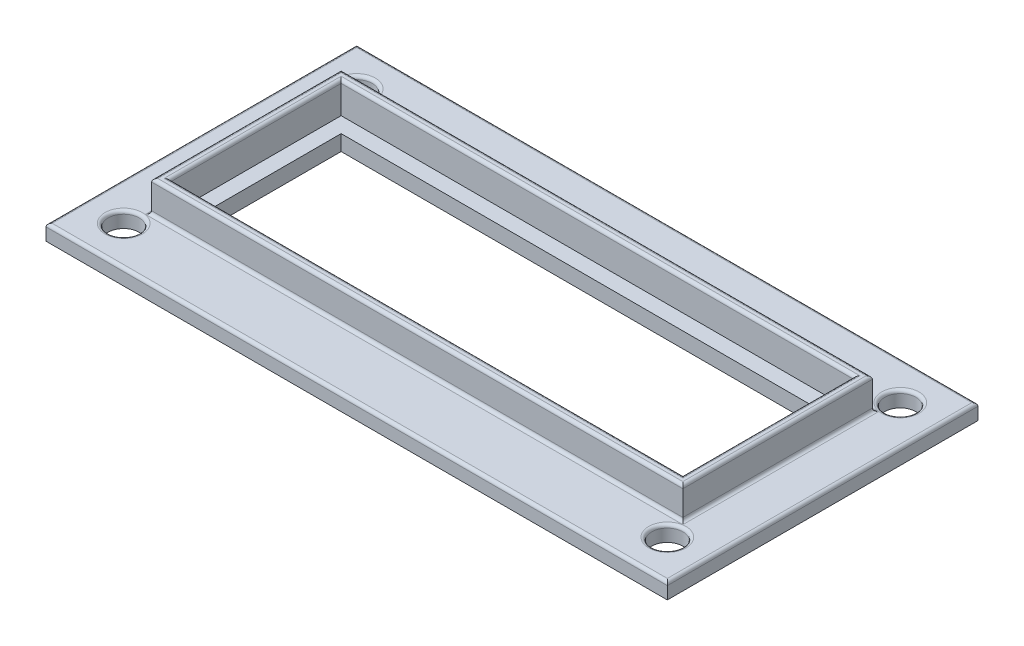
ISO-10303-21;
HEADER;
FILE_DESCRIPTION(('STEP AP214'),'2;1');
FILE_NAME('part.step','',(''),(''),'','','');
FILE_SCHEMA(('AUTOMOTIVE_DESIGN { 1 0 10303 214 1 1 1 1 }'));
ENDSEC;
DATA;
#1=APPLICATION_CONTEXT('core data for automotive mechanical design processes');
#2=APPLICATION_PROTOCOL_DEFINITION('international standard','automotive_design',2000,#1);
#3=PRODUCT_CONTEXT('',#1,'mechanical');
#4=PRODUCT('Part','Part','',(#3));
#5=PRODUCT_RELATED_PRODUCT_CATEGORY('part','',(#4));
#6=PRODUCT_DEFINITION_FORMATION('','',#4);
#7=PRODUCT_DEFINITION_CONTEXT('part definition',#1,'design');
#8=PRODUCT_DEFINITION('design','',#6,#7);
#9=PRODUCT_DEFINITION_SHAPE('','',#8);
#10=(LENGTH_UNIT() NAMED_UNIT(*) SI_UNIT(.MILLI.,.METRE.));
#11=(NAMED_UNIT(*) PLANE_ANGLE_UNIT() SI_UNIT($,.RADIAN.));
#12=(NAMED_UNIT(*) SI_UNIT($,.STERADIAN.) SOLID_ANGLE_UNIT());
#13=UNCERTAINTY_MEASURE_WITH_UNIT(LENGTH_MEASURE(1.E-05),#10,'distance_accuracy_value','');
#14=(GEOMETRIC_REPRESENTATION_CONTEXT(3) GLOBAL_UNCERTAINTY_ASSIGNED_CONTEXT((#13)) GLOBAL_UNIT_ASSIGNED_CONTEXT((#10,
#11,#12)) REPRESENTATION_CONTEXT('',''));
#15=CARTESIAN_POINT('',(0.,0.,0.));
#16=DIRECTION('',(0.,0.,1.));
#17=DIRECTION('',(1.,0.,0.));
#18=AXIS2_PLACEMENT_3D('',#15,#16,#17);
#19=CARTESIAN_POINT('',(0.,0.,0.));
#20=DIRECTION('',(0.,1.,0.));
#21=DIRECTION('',(0.,0.,1.));
#22=AXIS2_PLACEMENT_3D('',#19,#20,#21);
#23=PLANE('',#22);
#24=DIRECTION('',(0.,0.,1.));
#25=VECTOR('',#24,1.);
#26=CARTESIAN_POINT('',(-82.5,0.,-27.5));
#27=LINE('',#26,#25);
#28=CARTESIAN_POINT('',(-82.5,0.,-27.5));
#29=VERTEX_POINT('',#28);
#30=CARTESIAN_POINT('',(-82.5,0.,27.5));
#31=VERTEX_POINT('',#30);
#32=EDGE_CURVE('E283',#29,#31,#27,.T.);
#33=ORIENTED_EDGE('',*,*,#32,.T.);
#34=DIRECTION('',(1.,0.,0.));
#35=VECTOR('',#34,1.);
#36=CARTESIAN_POINT('',(-82.5,0.,27.5));
#37=LINE('',#36,#35);
#38=CARTESIAN_POINT('',(82.5,0.,27.5));
#39=VERTEX_POINT('',#38);
#40=EDGE_CURVE('E286',#31,#39,#37,.T.);
#41=ORIENTED_EDGE('',*,*,#40,.T.);
#42=DIRECTION('',(0.,0.,-1.));
#43=VECTOR('',#42,1.);
#44=CARTESIAN_POINT('',(82.5,0.,-27.5));
#45=LINE('',#44,#43);
#46=CARTESIAN_POINT('',(82.5,0.,-27.5));
#47=VERTEX_POINT('',#46);
#48=EDGE_CURVE('E269',#39,#47,#45,.T.);
#49=ORIENTED_EDGE('',*,*,#48,.T.);
#50=DIRECTION('',(-1.,0.,0.));
#51=VECTOR('',#50,1.);
#52=CARTESIAN_POINT('',(-82.5,0.,-27.5));
#53=LINE('',#52,#51);
#54=EDGE_CURVE('E280',#47,#29,#53,.T.);
#55=ORIENTED_EDGE('',*,*,#54,.T.);
#56=EDGE_LOOP('',(#33,#41,#49,#55));
#57=FACE_BOUND('',#56,.T.);
#58=DIRECTION('',(1.,0.,0.));
#59=VECTOR('',#58,1.);
#60=CARTESIAN_POINT('',(0.,0.,-22.5));
#61=LINE('',#60,#59);
#62=CARTESIAN_POINT('',(-77.5,0.,-22.5));
#63=VERTEX_POINT('',#62);
#64=CARTESIAN_POINT('',(77.5,0.,-22.5));
#65=VERTEX_POINT('',#64);
#66=EDGE_CURVE('E234',#63,#65,#61,.T.);
#67=ORIENTED_EDGE('',*,*,#66,.T.);
#68=DIRECTION('',(0.,0.,1.));
#69=VECTOR('',#68,1.);
#70=CARTESIAN_POINT('',(77.5,0.,0.));
#71=LINE('',#70,#69);
#72=CARTESIAN_POINT('',(77.5,0.,22.5));
#73=VERTEX_POINT('',#72);
#74=EDGE_CURVE('E203',#65,#73,#71,.T.);
#75=ORIENTED_EDGE('',*,*,#74,.T.);
#76=DIRECTION('',(-1.,0.,0.));
#77=VECTOR('',#76,1.);
#78=CARTESIAN_POINT('',(0.,0.,22.5));
#79=LINE('',#78,#77);
#80=CARTESIAN_POINT('',(-77.5,0.,22.5));
#81=VERTEX_POINT('',#80);
#82=EDGE_CURVE('E206',#73,#81,#79,.T.);
#83=ORIENTED_EDGE('',*,*,#82,.T.);
#84=DIRECTION('',(0.,0.,-1.));
#85=VECTOR('',#84,1.);
#86=CARTESIAN_POINT('',(-77.5,0.,0.));
#87=LINE('',#86,#85);
#88=EDGE_CURVE('E231',#81,#63,#87,.T.);
#89=ORIENTED_EDGE('',*,*,#88,.T.);
#90=EDGE_LOOP('',(#67,#75,#83,#89));
#91=FACE_BOUND('',#90,.T.);
#92=ADVANCED_FACE('F37',(#57,#91),#23,.T.);
#93=CARTESIAN_POINT('',(0.,-5.,0.));
#94=DIRECTION('',(0.,1.,0.));
#95=DIRECTION('',(0.,0.,1.));
#96=AXIS2_PLACEMENT_3D('',#93,#94,#95);
#97=PLANE('',#96);
#98=DIRECTION('',(0.,0.,-1.));
#99=VECTOR('',#98,1.);
#100=CARTESIAN_POINT('',(100.,-5.,-50.));
#101=LINE('',#100,#99);
#102=CARTESIAN_POINT('',(100.,-5.,50.));
#103=VERTEX_POINT('',#102);
#104=CARTESIAN_POINT('',(100.,-5.,-50.));
#105=VERTEX_POINT('',#104);
#106=EDGE_CURVE('E252',#103,#105,#101,.T.);
#107=ORIENTED_EDGE('',*,*,#106,.F.);
#108=DIRECTION('',(1.,0.,0.));
#109=VECTOR('',#108,1.);
#110=CARTESIAN_POINT('',(-100.,-5.,50.));
#111=LINE('',#110,#109);
#112=CARTESIAN_POINT('',(-100.,-5.,50.));
#113=VERTEX_POINT('',#112);
#114=EDGE_CURVE('E262',#113,#103,#111,.T.);
#115=ORIENTED_EDGE('',*,*,#114,.F.);
#116=DIRECTION('',(0.,0.,1.));
#117=VECTOR('',#116,1.);
#118=CARTESIAN_POINT('',(-100.,-5.,-50.));
#119=LINE('',#118,#117);
#120=CARTESIAN_POINT('',(-100.,-5.,-50.));
#121=VERTEX_POINT('',#120);
#122=EDGE_CURVE('E259',#121,#113,#119,.T.);
#123=ORIENTED_EDGE('',*,*,#122,.F.);
#124=DIRECTION('',(-1.,0.,0.));
#125=VECTOR('',#124,1.);
#126=CARTESIAN_POINT('',(-100.,-5.,-50.));
#127=LINE('',#126,#125);
#128=EDGE_CURVE('E255',#105,#121,#127,.T.);
#129=ORIENTED_EDGE('',*,*,#128,.F.);
#130=EDGE_LOOP('',(#107,#115,#123,#129));
#131=FACE_BOUND('',#130,.T.);
#132=CARTESIAN_POINT('',(-87.5,-5.,37.5));
#133=DIRECTION('',(0.,1.,0.));
#134=DIRECTION('',(0.,0.,1.));
#135=AXIS2_PLACEMENT_3D('',#132,#133,#134);
#136=CIRCLE('',#135,5.);
#137=CARTESIAN_POINT('',(-87.5,-5.,42.5));
#138=VERTEX_POINT('',#137);
#139=EDGE_CURVE('E248',#138,#138,#136,.T.);
#140=ORIENTED_EDGE('',*,*,#139,.T.);
#141=EDGE_LOOP('',(#140));
#142=FACE_BOUND('',#141,.T.);
#143=CARTESIAN_POINT('',(87.5,-5.,37.5));
#144=DIRECTION('',(0.,1.,0.));
#145=DIRECTION('',(0.,0.,1.));
#146=AXIS2_PLACEMENT_3D('',#143,#144,#145);
#147=CIRCLE('',#146,5.);
#148=CARTESIAN_POINT('',(87.5,-5.,42.5));
#149=VERTEX_POINT('',#148);
#150=EDGE_CURVE('E245',#149,#149,#147,.T.);
#151=ORIENTED_EDGE('',*,*,#150,.T.);
#152=EDGE_LOOP('',(#151));
#153=FACE_BOUND('',#152,.T.);
#154=CARTESIAN_POINT('',(87.5,-5.,-37.5));
#155=DIRECTION('',(0.,1.,0.));
#156=DIRECTION('',(0.,0.,1.));
#157=AXIS2_PLACEMENT_3D('',#154,#155,#156);
#158=CIRCLE('',#157,5.);
#159=CARTESIAN_POINT('',(87.5,-5.,-32.5));
#160=VERTEX_POINT('',#159);
#161=EDGE_CURVE('E241',#160,#160,#158,.T.);
#162=ORIENTED_EDGE('',*,*,#161,.T.);
#163=EDGE_LOOP('',(#162));
#164=FACE_BOUND('',#163,.T.);
#165=CARTESIAN_POINT('',(-87.5,-5.,-37.5));
#166=DIRECTION('',(0.,1.,0.));
#167=DIRECTION('',(0.,0.,1.));
#168=AXIS2_PLACEMENT_3D('',#165,#166,#167);
#169=CIRCLE('',#168,5.);
#170=CARTESIAN_POINT('',(-87.5,-5.,-32.5));
#171=VERTEX_POINT('',#170);
#172=EDGE_CURVE('E238',#171,#171,#169,.T.);
#173=ORIENTED_EDGE('',*,*,#172,.T.);
#174=EDGE_LOOP('',(#173));
#175=FACE_BOUND('',#174,.T.);
#176=DIRECTION('',(0.,0.,-1.));
#177=VECTOR('',#176,1.);
#178=CARTESIAN_POINT('',(77.5,-5.,22.5));
#179=LINE('',#178,#177);
#180=CARTESIAN_POINT('',(77.5,-5.,22.5));
#181=VERTEX_POINT('',#180);
#182=CARTESIAN_POINT('',(77.5,-5.,-22.5));
#183=VERTEX_POINT('',#182);
#184=EDGE_CURVE('E62',#181,#183,#179,.T.);
#185=ORIENTED_EDGE('',*,*,#184,.T.);
#186=DIRECTION('',(-1.,0.,0.));
#187=VECTOR('',#186,1.);
#188=CARTESIAN_POINT('',(-77.5,-5.,-22.5));
#189=LINE('',#188,#187);
#190=CARTESIAN_POINT('',(-77.5,-5.,-22.5));
#191=VERTEX_POINT('',#190);
#192=EDGE_CURVE('E210',#183,#191,#189,.T.);
#193=ORIENTED_EDGE('',*,*,#192,.T.);
#194=DIRECTION('',(0.,0.,1.));
#195=VECTOR('',#194,1.);
#196=CARTESIAN_POINT('',(-77.5,-5.,22.5));
#197=LINE('',#196,#195);
#198=CARTESIAN_POINT('',(-77.5,-5.,22.5));
#199=VERTEX_POINT('',#198);
#200=EDGE_CURVE('E216',#191,#199,#197,.T.);
#201=ORIENTED_EDGE('',*,*,#200,.T.);
#202=DIRECTION('',(1.,0.,0.));
#203=VECTOR('',#202,1.);
#204=CARTESIAN_POINT('',(-77.5,-5.,22.5));
#205=LINE('',#204,#203);
#206=EDGE_CURVE('E220',#199,#181,#205,.T.);
#207=ORIENTED_EDGE('',*,*,#206,.T.);
#208=EDGE_LOOP('',(#185,#193,#201,#207));
#209=FACE_BOUND('',#208,.T.);
#210=ADVANCED_FACE('F219',(#131,#142,#153,#164,#175,#209),#97,.F.);
#211=CARTESIAN_POINT('',(0.,10.,0.));
#212=DIRECTION('',(0.,-1.,0.));
#213=DIRECTION('',(0.,0.,-1.));
#214=AXIS2_PLACEMENT_3D('',#211,#212,#213);
#215=PLANE('',#214);
#216=DIRECTION('',(0.,0.,1.));
#217=VECTOR('',#216,1.);
#218=CARTESIAN_POINT('',(-83.5,10.,-27.5));
#219=LINE('',#218,#217);
#220=CARTESIAN_POINT('',(-83.5,10.,28.5));
#221=VERTEX_POINT('',#220);
#222=CARTESIAN_POINT('',(-83.5,10.,-28.5));
#223=VERTEX_POINT('',#222);
#224=EDGE_CURVE('E325',#221,#223,#219,.F.);
#225=ORIENTED_EDGE('',*,*,#224,.T.);
#226=DIRECTION('',(-1.,0.,0.));
#227=VECTOR('',#226,1.);
#228=CARTESIAN_POINT('',(82.5,10.,-28.5));
#229=LINE('',#228,#227);
#230=CARTESIAN_POINT('',(83.5,10.,-28.5));
#231=VERTEX_POINT('',#230);
#232=EDGE_CURVE('E327',#223,#231,#229,.F.);
#233=ORIENTED_EDGE('',*,*,#232,.T.);
#234=DIRECTION('',(0.,0.,-1.));
#235=VECTOR('',#234,1.);
#236=CARTESIAN_POINT('',(83.5,10.,27.5));
#237=LINE('',#236,#235);
#238=CARTESIAN_POINT('',(83.5,10.,28.5));
#239=VERTEX_POINT('',#238);
#240=EDGE_CURVE('E321',#231,#239,#237,.F.);
#241=ORIENTED_EDGE('',*,*,#240,.T.);
#242=DIRECTION('',(1.,0.,0.));
#243=VECTOR('',#242,1.);
#244=CARTESIAN_POINT('',(-82.5,10.,28.5));
#245=LINE('',#244,#243);
#246=EDGE_CURVE('E323',#239,#221,#245,.F.);
#247=ORIENTED_EDGE('',*,*,#246,.T.);
#248=EDGE_LOOP('',(#225,#233,#241,#247));
#249=FACE_BOUND('',#248,.T.);
#250=DIRECTION('',(1.,0.,0.));
#251=VECTOR('',#250,1.);
#252=CARTESIAN_POINT('',(0.,10.,29.5));
#253=LINE('',#252,#251);
#254=CARTESIAN_POINT('',(-84.5,10.,29.5));
#255=VERTEX_POINT('',#254);
#256=CARTESIAN_POINT('',(84.5,10.,29.5));
#257=VERTEX_POINT('',#256);
#258=EDGE_CURVE('E316',#255,#257,#253,.T.);
#259=ORIENTED_EDGE('',*,*,#258,.T.);
#260=DIRECTION('',(0.,0.,-1.));
#261=VECTOR('',#260,1.);
#262=CARTESIAN_POINT('',(84.5,10.,0.));
#263=LINE('',#262,#261);
#264=CARTESIAN_POINT('',(84.5,10.,-29.5));
#265=VERTEX_POINT('',#264);
#266=EDGE_CURVE('E318',#257,#265,#263,.T.);
#267=ORIENTED_EDGE('',*,*,#266,.T.);
#268=DIRECTION('',(-1.,0.,0.));
#269=VECTOR('',#268,1.);
#270=CARTESIAN_POINT('',(0.,10.,-29.5));
#271=LINE('',#270,#269);
#272=CARTESIAN_POINT('',(-84.5,10.,-29.5));
#273=VERTEX_POINT('',#272);
#274=EDGE_CURVE('E312',#265,#273,#271,.T.);
#275=ORIENTED_EDGE('',*,*,#274,.T.);
#276=DIRECTION('',(0.,0.,1.));
#277=VECTOR('',#276,1.);
#278=CARTESIAN_POINT('',(-84.5,10.,0.));
#279=LINE('',#278,#277);
#280=EDGE_CURVE('E314',#273,#255,#279,.T.);
#281=ORIENTED_EDGE('',*,*,#280,.T.);
#282=EDGE_LOOP('',(#259,#267,#275,#281));
#283=FACE_BOUND('',#282,.T.);
#284=ADVANCED_FACE('F478',(#249,#283),#215,.F.);
#285=CARTESIAN_POINT('',(-85.5,10.,-30.5));
#286=DIRECTION('',(0.,0.,1.));
#287=DIRECTION('',(1.,0.,0.));
#288=AXIS2_PLACEMENT_3D('',#285,#286,#287);
#289=PLANE('',#288);
#290=DIRECTION('',(0.,-1.,0.));
#291=VECTOR('',#290,1.);
#292=CARTESIAN_POINT('',(85.5,10.,-30.5));
#293=LINE('',#292,#291);
#294=CARTESIAN_POINT('',(85.5,9.,-30.5));
#295=VERTEX_POINT('',#294);
#296=CARTESIAN_POINT('',(85.5,0.999999999999999,-30.5));
#297=VERTEX_POINT('',#296);
#298=EDGE_CURVE('E297',#295,#297,#293,.T.);
#299=ORIENTED_EDGE('',*,*,#298,.T.);
#300=DIRECTION('',(-1.,0.,0.));
#301=VECTOR('',#300,1.);
#302=CARTESIAN_POINT('',(-85.5,0.999999999999999,-30.5));
#303=LINE('',#302,#301);
#304=CARTESIAN_POINT('',(-85.5,0.999999999999999,-30.5));
#305=VERTEX_POINT('',#304);
#306=EDGE_CURVE('E400',#297,#305,#303,.T.);
#307=ORIENTED_EDGE('',*,*,#306,.T.);
#308=DIRECTION('',(0.,-1.,0.));
#309=VECTOR('',#308,1.);
#310=CARTESIAN_POINT('',(-85.5,10.,-30.5));
#311=LINE('',#310,#309);
#312=CARTESIAN_POINT('',(-85.5,9.,-30.5));
#313=VERTEX_POINT('',#312);
#314=EDGE_CURVE('E306',#313,#305,#311,.T.);
#315=ORIENTED_EDGE('',*,*,#314,.F.);
#316=DIRECTION('',(-1.,0.,0.));
#317=VECTOR('',#316,1.);
#318=CARTESIAN_POINT('',(-85.5,9.,-30.5));
#319=LINE('',#318,#317);
#320=EDGE_CURVE('E343',#313,#295,#319,.F.);
#321=ORIENTED_EDGE('',*,*,#320,.T.);
#322=EDGE_LOOP('',(#299,#307,#315,#321));
#323=FACE_BOUND('',#322,.T.);
#324=ADVANCED_FACE('F937',(#323),#289,.F.);
#325=CARTESIAN_POINT('',(-85.5,10.,-30.5));
#326=DIRECTION('',(1.,0.,0.));
#327=DIRECTION('',(0.,0.,-1.));
#328=AXIS2_PLACEMENT_3D('',#325,#326,#327);
#329=PLANE('',#328);
#330=ORIENTED_EDGE('',*,*,#314,.T.);
#331=DIRECTION('',(0.,0.,1.));
#332=VECTOR('',#331,1.);
#333=CARTESIAN_POINT('',(-85.5,0.999999999999999,-30.5));
#334=LINE('',#333,#332);
#335=CARTESIAN_POINT('',(-85.5,0.999999999999999,30.5));
#336=VERTEX_POINT('',#335);
#337=EDGE_CURVE('E345',#305,#336,#334,.T.);
#338=ORIENTED_EDGE('',*,*,#337,.T.);
#339=DIRECTION('',(0.,-1.,0.));
#340=VECTOR('',#339,1.);
#341=CARTESIAN_POINT('',(-85.5,10.,30.5));
#342=LINE('',#341,#340);
#343=CARTESIAN_POINT('',(-85.5,9.,30.5));
#344=VERTEX_POINT('',#343);
#345=EDGE_CURVE('E303',#344,#336,#342,.T.);
#346=ORIENTED_EDGE('',*,*,#345,.F.);
#347=DIRECTION('',(0.,0.,1.));
#348=VECTOR('',#347,1.);
#349=CARTESIAN_POINT('',(-85.5,9.,-30.5));
#350=LINE('',#349,#348);
#351=EDGE_CURVE('E341',#344,#313,#350,.F.);
#352=ORIENTED_EDGE('',*,*,#351,.T.);
#353=EDGE_LOOP('',(#330,#338,#346,#352));
#354=FACE_BOUND('',#353,.T.);
#355=ADVANCED_FACE('F926',(#354),#329,.F.);
#356=CARTESIAN_POINT('',(-85.5,10.,30.5));
#357=DIRECTION('',(0.,0.,-1.));
#358=DIRECTION('',(-1.,0.,0.));
#359=AXIS2_PLACEMENT_3D('',#356,#357,#358);
#360=PLANE('',#359);
#361=ORIENTED_EDGE('',*,*,#345,.T.);
#362=DIRECTION('',(1.,0.,0.));
#363=VECTOR('',#362,1.);
#364=CARTESIAN_POINT('',(-85.5,0.999999999999999,30.5));
#365=LINE('',#364,#363);
#366=CARTESIAN_POINT('',(85.5,0.999999999999999,30.5));
#367=VERTEX_POINT('',#366);
#368=EDGE_CURVE('E396',#336,#367,#365,.T.);
#369=ORIENTED_EDGE('',*,*,#368,.T.);
#370=DIRECTION('',(0.,-1.,0.));
#371=VECTOR('',#370,1.);
#372=CARTESIAN_POINT('',(85.5,10.,30.5));
#373=LINE('',#372,#371);
#374=CARTESIAN_POINT('',(85.5,9.,30.5));
#375=VERTEX_POINT('',#374);
#376=EDGE_CURVE('E300',#375,#367,#373,.T.);
#377=ORIENTED_EDGE('',*,*,#376,.F.);
#378=DIRECTION('',(1.,0.,0.));
#379=VECTOR('',#378,1.);
#380=CARTESIAN_POINT('',(-85.5,9.,30.5));
#381=LINE('',#380,#379);
#382=EDGE_CURVE('E339',#375,#344,#381,.F.);
#383=ORIENTED_EDGE('',*,*,#382,.T.);
#384=EDGE_LOOP('',(#361,#369,#377,#383));
#385=FACE_BOUND('',#384,.T.);
#386=ADVANCED_FACE('F915',(#385),#360,.F.);
#387=CARTESIAN_POINT('',(85.5,10.,-30.5));
#388=DIRECTION('',(-1.,0.,0.));
#389=DIRECTION('',(0.,0.,1.));
#390=AXIS2_PLACEMENT_3D('',#387,#388,#389);
#391=PLANE('',#390);
#392=ORIENTED_EDGE('',*,*,#376,.T.);
#393=DIRECTION('',(0.,0.,-1.));
#394=VECTOR('',#393,1.);
#395=CARTESIAN_POINT('',(85.5,0.999999999999999,-30.5));
#396=LINE('',#395,#394);
#397=EDGE_CURVE('E398',#367,#297,#396,.T.);
#398=ORIENTED_EDGE('',*,*,#397,.T.);
#399=ORIENTED_EDGE('',*,*,#298,.F.);
#400=DIRECTION('',(0.,0.,-1.));
#401=VECTOR('',#400,1.);
#402=CARTESIAN_POINT('',(85.5,9.,-30.5));
#403=LINE('',#402,#401);
#404=EDGE_CURVE('E336',#295,#375,#403,.F.);
#405=ORIENTED_EDGE('',*,*,#404,.T.);
#406=EDGE_LOOP('',(#392,#398,#399,#405));
#407=FACE_BOUND('',#406,.T.);
#408=ADVANCED_FACE('F904',(#407),#391,.F.);
#409=CARTESIAN_POINT('',(82.5,10.,-27.5));
#410=DIRECTION('',(-1.,0.,0.));
#411=DIRECTION('',(0.,0.,1.));
#412=AXIS2_PLACEMENT_3D('',#409,#410,#411);
#413=PLANE('',#412);
#414=DIRECTION('',(0.,-1.,0.));
#415=VECTOR('',#414,1.);
#416=CARTESIAN_POINT('',(82.5,10.,27.5));
#417=LINE('',#416,#415);
#418=CARTESIAN_POINT('',(82.5,9.,27.5));
#419=VERTEX_POINT('',#418);
#420=EDGE_CURVE('E289',#419,#39,#417,.T.);
#421=ORIENTED_EDGE('',*,*,#420,.F.);
#422=DIRECTION('',(0.,0.,-1.));
#423=VECTOR('',#422,1.);
#424=CARTESIAN_POINT('',(82.5,9.,-27.5));
#425=LINE('',#424,#423);
#426=CARTESIAN_POINT('',(82.5,9.,-27.5));
#427=VERTEX_POINT('',#426);
#428=EDGE_CURVE('E334',#419,#427,#425,.T.);
#429=ORIENTED_EDGE('',*,*,#428,.T.);
#430=DIRECTION('',(0.,-1.,0.));
#431=VECTOR('',#430,1.);
#432=CARTESIAN_POINT('',(82.5,10.,-27.5));
#433=LINE('',#432,#431);
#434=EDGE_CURVE('E295',#427,#47,#433,.T.);
#435=ORIENTED_EDGE('',*,*,#434,.T.);
#436=ORIENTED_EDGE('',*,*,#48,.F.);
#437=EDGE_LOOP('',(#421,#429,#435,#436));
#438=FACE_BOUND('',#437,.T.);
#439=ADVANCED_FACE('F893',(#438),#413,.T.);
#440=CARTESIAN_POINT('',(-82.5,10.,-27.5));
#441=DIRECTION('',(0.,0.,1.));
#442=DIRECTION('',(1.,0.,0.));
#443=AXIS2_PLACEMENT_3D('',#440,#441,#442);
#444=PLANE('',#443);
#445=ORIENTED_EDGE('',*,*,#434,.F.);
#446=DIRECTION('',(-1.,0.,0.));
#447=VECTOR('',#446,1.);
#448=CARTESIAN_POINT('',(-82.5,9.,-27.5));
#449=LINE('',#448,#447);
#450=CARTESIAN_POINT('',(-82.5,9.,-27.5));
#451=VERTEX_POINT('',#450);
#452=EDGE_CURVE('E309',#427,#451,#449,.T.);
#453=ORIENTED_EDGE('',*,*,#452,.T.);
#454=DIRECTION('',(0.,-1.,0.));
#455=VECTOR('',#454,1.);
#456=CARTESIAN_POINT('',(-82.5,10.,-27.5));
#457=LINE('',#456,#455);
#458=EDGE_CURVE('E293',#451,#29,#457,.T.);
#459=ORIENTED_EDGE('',*,*,#458,.T.);
#460=ORIENTED_EDGE('',*,*,#54,.F.);
#461=EDGE_LOOP('',(#445,#453,#459,#460));
#462=FACE_BOUND('',#461,.T.);
#463=ADVANCED_FACE('F882',(#462),#444,.T.);
#464=CARTESIAN_POINT('',(-82.5,10.,-27.5));
#465=DIRECTION('',(1.,0.,0.));
#466=DIRECTION('',(0.,0.,-1.));
#467=AXIS2_PLACEMENT_3D('',#464,#465,#466);
#468=PLANE('',#467);
#469=ORIENTED_EDGE('',*,*,#458,.F.);
#470=DIRECTION('',(0.,0.,1.));
#471=VECTOR('',#470,1.);
#472=CARTESIAN_POINT('',(-82.5,9.,27.5));
#473=LINE('',#472,#471);
#474=CARTESIAN_POINT('',(-82.5,9.,27.5));
#475=VERTEX_POINT('',#474);
#476=EDGE_CURVE('E330',#451,#475,#473,.T.);
#477=ORIENTED_EDGE('',*,*,#476,.T.);
#478=DIRECTION('',(0.,-1.,0.));
#479=VECTOR('',#478,1.);
#480=CARTESIAN_POINT('',(-82.5,10.,27.5));
#481=LINE('',#480,#479);
#482=EDGE_CURVE('E291',#475,#31,#481,.T.);
#483=ORIENTED_EDGE('',*,*,#482,.T.);
#484=ORIENTED_EDGE('',*,*,#32,.F.);
#485=EDGE_LOOP('',(#469,#477,#483,#484));
#486=FACE_BOUND('',#485,.T.);
#487=ADVANCED_FACE('F489',(#486),#468,.T.);
#488=CARTESIAN_POINT('',(-82.5,10.,27.5));
#489=DIRECTION('',(0.,0.,-1.));
#490=DIRECTION('',(-1.,0.,0.));
#491=AXIS2_PLACEMENT_3D('',#488,#489,#490);
#492=PLANE('',#491);
#493=ORIENTED_EDGE('',*,*,#482,.F.);
#494=DIRECTION('',(1.,0.,0.));
#495=VECTOR('',#494,1.);
#496=CARTESIAN_POINT('',(82.5,9.,27.5));
#497=LINE('',#496,#495);
#498=EDGE_CURVE('E332',#475,#419,#497,.T.);
#499=ORIENTED_EDGE('',*,*,#498,.T.);
#500=ORIENTED_EDGE('',*,*,#420,.T.);
#501=ORIENTED_EDGE('',*,*,#40,.F.);
#502=EDGE_LOOP('',(#493,#499,#500,#501));
#503=FACE_BOUND('',#502,.T.);
#504=ADVANCED_FACE('F482',(#503),#492,.T.);
#505=DIRECTION('',(1.,0.,0.));
#506=VECTOR('',#505,1.);
#507=CARTESIAN_POINT('',(0.,0.,31.5));
#508=LINE('',#507,#506);
#509=CARTESIAN_POINT('',(86.5,0.,31.5));
#510=VERTEX_POINT('',#509);
#511=CARTESIAN_POINT('',(-86.5,0.,31.5));
#512=VERTEX_POINT('',#511);
#513=EDGE_CURVE('E391',#510,#512,#508,.F.);
#514=ORIENTED_EDGE('',*,*,#513,.T.);
#515=DIRECTION('',(0.,0.,1.));
#516=VECTOR('',#515,1.);
#517=CARTESIAN_POINT('',(-86.5,0.,0.));
#518=LINE('',#517,#516);
#519=CARTESIAN_POINT('',(-86.5,0.,-31.5));
#520=VERTEX_POINT('',#519);
#521=EDGE_CURVE('E393',#512,#520,#518,.F.);
#522=ORIENTED_EDGE('',*,*,#521,.T.);
#523=DIRECTION('',(-1.,0.,0.));
#524=VECTOR('',#523,1.);
#525=CARTESIAN_POINT('',(0.,0.,-31.5));
#526=LINE('',#525,#524);
#527=CARTESIAN_POINT('',(86.5,0.,-31.5));
#528=VERTEX_POINT('',#527);
#529=EDGE_CURVE('E387',#520,#528,#526,.F.);
#530=ORIENTED_EDGE('',*,*,#529,.T.);
#531=DIRECTION('',(0.,0.,-1.));
#532=VECTOR('',#531,1.);
#533=CARTESIAN_POINT('',(86.5,0.,0.));
#534=LINE('',#533,#532);
#535=EDGE_CURVE('E389',#528,#510,#534,.F.);
#536=ORIENTED_EDGE('',*,*,#535,.T.);
#537=EDGE_LOOP('',(#514,#522,#530,#536));
#538=FACE_BOUND('',#537,.T.);
#539=DIRECTION('',(0.,0.,1.));
#540=VECTOR('',#539,1.);
#541=CARTESIAN_POINT('',(-99.,0.,0.));
#542=LINE('',#541,#540);
#543=CARTESIAN_POINT('',(-99.,0.,-49.));
#544=VERTEX_POINT('',#543);
#545=CARTESIAN_POINT('',(-99.,0.,49.));
#546=VERTEX_POINT('',#545);
#547=EDGE_CURVE('E382',#544,#546,#542,.T.);
#548=ORIENTED_EDGE('',*,*,#547,.T.);
#549=DIRECTION('',(1.,0.,0.));
#550=VECTOR('',#549,1.);
#551=CARTESIAN_POINT('',(0.,0.,49.));
#552=LINE('',#551,#550);
#553=CARTESIAN_POINT('',(99.,0.,49.));
#554=VERTEX_POINT('',#553);
#555=EDGE_CURVE('E384',#546,#554,#552,.T.);
#556=ORIENTED_EDGE('',*,*,#555,.T.);
#557=DIRECTION('',(0.,0.,-1.));
#558=VECTOR('',#557,1.);
#559=CARTESIAN_POINT('',(99.,0.,0.));
#560=LINE('',#559,#558);
#561=CARTESIAN_POINT('',(99.,0.,-49.));
#562=VERTEX_POINT('',#561);
#563=EDGE_CURVE('E378',#554,#562,#560,.T.);
#564=ORIENTED_EDGE('',*,*,#563,.T.);
#565=DIRECTION('',(-1.,0.,0.));
#566=VECTOR('',#565,1.);
#567=CARTESIAN_POINT('',(0.,0.,-49.));
#568=LINE('',#567,#566);
#569=EDGE_CURVE('E380',#562,#544,#568,.T.);
#570=ORIENTED_EDGE('',*,*,#569,.T.);
#571=EDGE_LOOP('',(#548,#556,#564,#570));
#572=FACE_BOUND('',#571,.T.);
#573=CARTESIAN_POINT('',(-87.5,0.,37.5));
#574=DIRECTION('',(0.,1.,0.));
#575=DIRECTION('',(0.,0.,1.));
#576=AXIS2_PLACEMENT_3D('',#573,#574,#575);
#577=CIRCLE('',#576,6.);
#578=CARTESIAN_POINT('',(-87.5,0.,43.5));
#579=VERTEX_POINT('',#578);
#580=EDGE_CURVE('E375',#579,#579,#577,.F.);
#581=ORIENTED_EDGE('',*,*,#580,.T.);
#582=EDGE_LOOP('',(#581));
#583=FACE_BOUND('',#582,.T.);
#584=CARTESIAN_POINT('',(87.5,0.,37.5));
#585=DIRECTION('',(0.,1.,0.));
#586=DIRECTION('',(0.,0.,1.));
#587=AXIS2_PLACEMENT_3D('',#584,#585,#586);
#588=CIRCLE('',#587,6.);
#589=CARTESIAN_POINT('',(87.5,0.,43.5));
#590=VERTEX_POINT('',#589);
#591=EDGE_CURVE('E372',#590,#590,#588,.F.);
#592=ORIENTED_EDGE('',*,*,#591,.T.);
#593=EDGE_LOOP('',(#592));
#594=FACE_BOUND('',#593,.T.);
#595=CARTESIAN_POINT('',(87.5,0.,-37.5));
#596=DIRECTION('',(0.,1.,0.));
#597=DIRECTION('',(0.,0.,1.));
#598=AXIS2_PLACEMENT_3D('',#595,#596,#597);
#599=CIRCLE('',#598,6.);
#600=CARTESIAN_POINT('',(87.5,0.,-31.5));
#601=VERTEX_POINT('',#600);
#602=EDGE_CURVE('E369',#601,#601,#599,.F.);
#603=ORIENTED_EDGE('',*,*,#602,.T.);
#604=EDGE_LOOP('',(#603));
#605=FACE_BOUND('',#604,.T.);
#606=CARTESIAN_POINT('',(-87.5,0.,-37.5));
#607=DIRECTION('',(0.,1.,0.));
#608=DIRECTION('',(0.,0.,1.));
#609=AXIS2_PLACEMENT_3D('',#606,#607,#608);
#610=CIRCLE('',#609,6.);
#611=CARTESIAN_POINT('',(-87.5,0.,-31.5));
#612=VERTEX_POINT('',#611);
#613=EDGE_CURVE('E366',#612,#612,#610,.F.);
#614=ORIENTED_EDGE('',*,*,#613,.T.);
#615=EDGE_LOOP('',(#614));
#616=FACE_BOUND('',#615,.T.);
#617=ADVANCED_FACE('F474',(#538,#572,#583,#594,#605,#616),#23,.T.);
#618=CARTESIAN_POINT('',(100.,-5.,-50.));
#619=DIRECTION('',(1.,0.,0.));
#620=DIRECTION('',(0.,0.,-1.));
#621=AXIS2_PLACEMENT_3D('',#618,#619,#620);
#622=PLANE('',#621);
#623=DIRECTION('',(0.,1.,0.));
#624=VECTOR('',#623,1.);
#625=CARTESIAN_POINT('',(100.,-5.,-50.));
#626=LINE('',#625,#624);
#627=CARTESIAN_POINT('',(100.,-1.,-50.));
#628=VERTEX_POINT('',#627);
#629=EDGE_CURVE('E265',#105,#628,#626,.T.);
#630=ORIENTED_EDGE('',*,*,#629,.T.);
#631=DIRECTION('',(0.,0.,-1.));
#632=VECTOR('',#631,1.);
#633=CARTESIAN_POINT('',(100.,-1.,-50.));
#634=LINE('',#633,#632);
#635=CARTESIAN_POINT('',(100.,-1.,50.));
#636=VERTEX_POINT('',#635);
#637=EDGE_CURVE('E409',#628,#636,#634,.F.);
#638=ORIENTED_EDGE('',*,*,#637,.T.);
#639=DIRECTION('',(0.,1.,0.));
#640=VECTOR('',#639,1.);
#641=CARTESIAN_POINT('',(100.,-5.,50.));
#642=LINE('',#641,#640);
#643=EDGE_CURVE('E266',#103,#636,#642,.T.);
#644=ORIENTED_EDGE('',*,*,#643,.F.);
#645=ORIENTED_EDGE('',*,*,#106,.T.);
#646=EDGE_LOOP('',(#630,#638,#644,#645));
#647=FACE_BOUND('',#646,.T.);
#648=ADVANCED_FACE('F451',(#647),#622,.T.);
#649=CARTESIAN_POINT('',(-100.,-5.,50.));
#650=DIRECTION('',(0.,0.,1.));
#651=DIRECTION('',(1.,0.,0.));
#652=AXIS2_PLACEMENT_3D('',#649,#650,#651);
#653=PLANE('',#652);
#654=ORIENTED_EDGE('',*,*,#643,.T.);
#655=DIRECTION('',(1.,0.,0.));
#656=VECTOR('',#655,1.);
#657=CARTESIAN_POINT('',(-100.,-1.,50.));
#658=LINE('',#657,#656);
#659=CARTESIAN_POINT('',(-100.,-1.,50.));
#660=VERTEX_POINT('',#659);
#661=EDGE_CURVE('E402',#636,#660,#658,.F.);
#662=ORIENTED_EDGE('',*,*,#661,.T.);
#663=DIRECTION('',(0.,1.,0.));
#664=VECTOR('',#663,1.);
#665=CARTESIAN_POINT('',(-100.,-5.,50.));
#666=LINE('',#665,#664);
#667=EDGE_CURVE('E270',#113,#660,#666,.T.);
#668=ORIENTED_EDGE('',*,*,#667,.F.);
#669=ORIENTED_EDGE('',*,*,#114,.T.);
#670=EDGE_LOOP('',(#654,#662,#668,#669));
#671=FACE_BOUND('',#670,.T.);
#672=ADVANCED_FACE('F458',(#671),#653,.T.);
#673=CARTESIAN_POINT('',(-100.,-5.,-50.));
#674=DIRECTION('',(-1.,0.,0.));
#675=DIRECTION('',(0.,0.,1.));
#676=AXIS2_PLACEMENT_3D('',#673,#674,#675);
#677=PLANE('',#676);
#678=ORIENTED_EDGE('',*,*,#667,.T.);
#679=DIRECTION('',(0.,0.,1.));
#680=VECTOR('',#679,1.);
#681=CARTESIAN_POINT('',(-100.,-1.,-50.));
#682=LINE('',#681,#680);
#683=CARTESIAN_POINT('',(-100.,-1.,-50.));
#684=VERTEX_POINT('',#683);
#685=EDGE_CURVE('E405',#660,#684,#682,.F.);
#686=ORIENTED_EDGE('',*,*,#685,.T.);
#687=DIRECTION('',(0.,1.,0.));
#688=VECTOR('',#687,1.);
#689=CARTESIAN_POINT('',(-100.,-5.,-50.));
#690=LINE('',#689,#688);
#691=EDGE_CURVE('E273',#121,#684,#690,.T.);
#692=ORIENTED_EDGE('',*,*,#691,.F.);
#693=ORIENTED_EDGE('',*,*,#122,.T.);
#694=EDGE_LOOP('',(#678,#686,#692,#693));
#695=FACE_BOUND('',#694,.T.);
#696=ADVANCED_FACE('F461',(#695),#677,.T.);
#697=CARTESIAN_POINT('',(-100.,-5.,-50.));
#698=DIRECTION('',(0.,0.,-1.));
#699=DIRECTION('',(-1.,0.,0.));
#700=AXIS2_PLACEMENT_3D('',#697,#698,#699);
#701=PLANE('',#700);
#702=ORIENTED_EDGE('',*,*,#691,.T.);
#703=DIRECTION('',(-1.,0.,0.));
#704=VECTOR('',#703,1.);
#705=CARTESIAN_POINT('',(-100.,-1.,-50.));
#706=LINE('',#705,#704);
#707=EDGE_CURVE('E407',#684,#628,#706,.F.);
#708=ORIENTED_EDGE('',*,*,#707,.T.);
#709=ORIENTED_EDGE('',*,*,#629,.F.);
#710=ORIENTED_EDGE('',*,*,#128,.T.);
#711=EDGE_LOOP('',(#702,#708,#709,#710));
#712=FACE_BOUND('',#711,.T.);
#713=ADVANCED_FACE('F448',(#712),#701,.T.);
#714=CARTESIAN_POINT('',(-82.5,9.,28.5));
#715=DIRECTION('',(-1.,0.,0.));
#716=DIRECTION('',(0.,0.,1.));
#717=AXIS2_PLACEMENT_3D('',#714,#715,#716);
#718=CYLINDRICAL_SURFACE('',#717,1.);
#719=CARTESIAN_POINT('',(-83.5,9.,28.5));
#720=DIRECTION('',(-0.707106781186547,0.,-0.707106781186547));
#721=DIRECTION('',(0.707106781186547,0.,-0.707106781186547));
#722=AXIS2_PLACEMENT_3D('',#719,#720,#721);
#723=ELLIPSE('',#722,1.41421356237309,1.);
#724=EDGE_CURVE('E351',#221,#475,#723,.T.);
#725=ORIENTED_EDGE('',*,*,#724,.F.);
#726=ORIENTED_EDGE('',*,*,#246,.F.);
#727=CARTESIAN_POINT('',(83.5,9.,28.5));
#728=DIRECTION('',(-0.707106781186547,0.,0.707106781186547));
#729=DIRECTION('',(-0.707106781186547,0.,-0.707106781186547));
#730=AXIS2_PLACEMENT_3D('',#727,#728,#729);
#731=ELLIPSE('',#730,1.41421356237309,1.);
#732=EDGE_CURVE('E256',#419,#239,#731,.F.);
#733=ORIENTED_EDGE('',*,*,#732,.F.);
#734=ORIENTED_EDGE('',*,*,#498,.F.);
#735=EDGE_LOOP('',(#725,#726,#733,#734));
#736=FACE_BOUND('',#735,.T.);
#737=ADVANCED_FACE('F468',(#736),#718,.T.);
#738=CARTESIAN_POINT('',(83.5,9.,-27.5));
#739=DIRECTION('',(0.,0.,1.));
#740=DIRECTION('',(1.,0.,0.));
#741=AXIS2_PLACEMENT_3D('',#738,#739,#740);
#742=CYLINDRICAL_SURFACE('',#741,1.);
#743=ORIENTED_EDGE('',*,*,#732,.T.);
#744=ORIENTED_EDGE('',*,*,#240,.F.);
#745=CARTESIAN_POINT('',(83.5,9.,-28.5));
#746=DIRECTION('',(0.707106781186547,0.,0.707106781186547));
#747=DIRECTION('',(0.707106781186547,0.,-0.707106781186547));
#748=AXIS2_PLACEMENT_3D('',#745,#746,#747);
#749=ELLIPSE('',#748,1.41421356237309,1.);
#750=EDGE_CURVE('E348',#427,#231,#749,.F.);
#751=ORIENTED_EDGE('',*,*,#750,.F.);
#752=ORIENTED_EDGE('',*,*,#428,.F.);
#753=EDGE_LOOP('',(#743,#744,#751,#752));
#754=FACE_BOUND('',#753,.T.);
#755=ADVANCED_FACE('F811',(#754),#742,.T.);
#756=CARTESIAN_POINT('',(-83.5,9.,-27.5));
#757=DIRECTION('',(0.,0.,-1.));
#758=DIRECTION('',(-1.,0.,0.));
#759=AXIS2_PLACEMENT_3D('',#756,#757,#758);
#760=CYLINDRICAL_SURFACE('',#759,1.);
#761=ORIENTED_EDGE('',*,*,#724,.T.);
#762=ORIENTED_EDGE('',*,*,#476,.F.);
#763=CARTESIAN_POINT('',(-83.5,9.,-28.5));
#764=DIRECTION('',(0.707106781186547,0.,-0.707106781186547));
#765=DIRECTION('',(0.707106781186547,0.,0.707106781186547));
#766=AXIS2_PLACEMENT_3D('',#763,#764,#765);
#767=ELLIPSE('',#766,1.41421356237309,1.);
#768=EDGE_CURVE('E346',#223,#451,#767,.T.);
#769=ORIENTED_EDGE('',*,*,#768,.F.);
#770=ORIENTED_EDGE('',*,*,#224,.F.);
#771=EDGE_LOOP('',(#761,#762,#769,#770));
#772=FACE_BOUND('',#771,.T.);
#773=ADVANCED_FACE('F800',(#772),#760,.T.);
#774=CARTESIAN_POINT('',(-82.5,9.,-28.5));
#775=DIRECTION('',(1.,0.,0.));
#776=DIRECTION('',(0.,0.,-1.));
#777=AXIS2_PLACEMENT_3D('',#774,#775,#776);
#778=CYLINDRICAL_SURFACE('',#777,1.);
#779=ORIENTED_EDGE('',*,*,#750,.T.);
#780=ORIENTED_EDGE('',*,*,#232,.F.);
#781=ORIENTED_EDGE('',*,*,#768,.T.);
#782=ORIENTED_EDGE('',*,*,#452,.F.);
#783=EDGE_LOOP('',(#779,#780,#781,#782));
#784=FACE_BOUND('',#783,.T.);
#785=ADVANCED_FACE('F789',(#784),#778,.T.);
#786=CARTESIAN_POINT('',(-84.5,9.,0.));
#787=DIRECTION('',(0.,0.,1.));
#788=DIRECTION('',(1.,0.,0.));
#789=AXIS2_PLACEMENT_3D('',#786,#787,#788);
#790=CYLINDRICAL_SURFACE('',#789,1.);
#791=CARTESIAN_POINT('',(-84.5,9.,-29.5));
#792=DIRECTION('',(-0.707106781186547,0.,0.707106781186547));
#793=DIRECTION('',(-0.707106781186547,0.,-0.707106781186547));
#794=AXIS2_PLACEMENT_3D('',#791,#792,#793);
#795=ELLIPSE('',#794,1.41421356237309,1.);
#796=EDGE_CURVE('E359',#313,#273,#795,.F.);
#797=ORIENTED_EDGE('',*,*,#796,.F.);
#798=ORIENTED_EDGE('',*,*,#351,.F.);
#799=CARTESIAN_POINT('',(-84.5,9.,29.5));
#800=DIRECTION('',(0.707106781186547,0.,0.707106781186547));
#801=DIRECTION('',(-0.707106781186547,0.,0.707106781186547));
#802=AXIS2_PLACEMENT_3D('',#799,#800,#801);
#803=ELLIPSE('',#802,1.41421356237309,1.);
#804=EDGE_CURVE('E349',#255,#344,#803,.T.);
#805=ORIENTED_EDGE('',*,*,#804,.F.);
#806=ORIENTED_EDGE('',*,*,#280,.F.);
#807=EDGE_LOOP('',(#797,#798,#805,#806));
#808=FACE_BOUND('',#807,.T.);
#809=ADVANCED_FACE('F778',(#808),#790,.T.);
#810=CARTESIAN_POINT('',(0.,9.,29.5));
#811=DIRECTION('',(1.,0.,0.));
#812=DIRECTION('',(0.,0.,-1.));
#813=AXIS2_PLACEMENT_3D('',#810,#811,#812);
#814=CYLINDRICAL_SURFACE('',#813,1.);
#815=ORIENTED_EDGE('',*,*,#804,.T.);
#816=ORIENTED_EDGE('',*,*,#382,.F.);
#817=CARTESIAN_POINT('',(84.5,9.,29.5));
#818=DIRECTION('',(0.707106781186547,0.,-0.707106781186548));
#819=DIRECTION('',(0.707106781186548,0.,0.707106781186547));
#820=AXIS2_PLACEMENT_3D('',#817,#818,#819);
#821=ELLIPSE('',#820,1.4142135623731,1.);
#822=EDGE_CURVE('E357',#257,#375,#821,.T.);
#823=ORIENTED_EDGE('',*,*,#822,.F.);
#824=ORIENTED_EDGE('',*,*,#258,.F.);
#825=EDGE_LOOP('',(#815,#816,#823,#824));
#826=FACE_BOUND('',#825,.T.);
#827=ADVANCED_FACE('F767',(#826),#814,.T.);
#828=CARTESIAN_POINT('',(0.,9.,-29.5));
#829=DIRECTION('',(-1.,0.,0.));
#830=DIRECTION('',(0.,0.,1.));
#831=AXIS2_PLACEMENT_3D('',#828,#829,#830);
#832=CYLINDRICAL_SURFACE('',#831,1.);
#833=ORIENTED_EDGE('',*,*,#796,.T.);
#834=ORIENTED_EDGE('',*,*,#274,.F.);
#835=CARTESIAN_POINT('',(84.5,9.,-29.5));
#836=DIRECTION('',(-0.707106781186548,0.,-0.707106781186547));
#837=DIRECTION('',(-0.707106781186547,0.,0.707106781186548));
#838=AXIS2_PLACEMENT_3D('',#835,#836,#837);
#839=ELLIPSE('',#838,1.41421356237309,1.);
#840=EDGE_CURVE('E251',#295,#265,#839,.F.);
#841=ORIENTED_EDGE('',*,*,#840,.F.);
#842=ORIENTED_EDGE('',*,*,#320,.F.);
#843=EDGE_LOOP('',(#833,#834,#841,#842));
#844=FACE_BOUND('',#843,.T.);
#845=ADVANCED_FACE('F540',(#844),#832,.T.);
#846=CARTESIAN_POINT('',(84.5,9.,0.));
#847=DIRECTION('',(0.,0.,-1.));
#848=DIRECTION('',(-1.,0.,0.));
#849=AXIS2_PLACEMENT_3D('',#846,#847,#848);
#850=CYLINDRICAL_SURFACE('',#849,1.);
#851=ORIENTED_EDGE('',*,*,#822,.T.);
#852=ORIENTED_EDGE('',*,*,#404,.F.);
#853=ORIENTED_EDGE('',*,*,#840,.T.);
#854=ORIENTED_EDGE('',*,*,#266,.F.);
#855=EDGE_LOOP('',(#851,#852,#853,#854));
#856=FACE_BOUND('',#855,.T.);
#857=ADVANCED_FACE('F535',(#856),#850,.T.);
#858=CARTESIAN_POINT('',(-87.5,0.,37.5));
#859=DIRECTION('',(0.,1.,0.));
#860=DIRECTION('',(0.,0.,1.));
#861=AXIS2_PLACEMENT_3D('',#858,#859,#860);
#862=CYLINDRICAL_SURFACE('',#861,5.);
#863=CARTESIAN_POINT('',(-87.5,-1.,37.5));
#864=DIRECTION('',(0.,1.,0.));
#865=DIRECTION('',(0.,0.,1.));
#866=AXIS2_PLACEMENT_3D('',#863,#864,#865);
#867=CIRCLE('',#866,5.);
#868=CARTESIAN_POINT('',(-87.5,-1.,42.5));
#869=VERTEX_POINT('',#868);
#870=EDGE_CURVE('E411',#869,#869,#867,.T.);
#871=ORIENTED_EDGE('',*,*,#870,.T.);
#872=EDGE_LOOP('',(#871));
#873=FACE_BOUND('',#872,.T.);
#874=ORIENTED_EDGE('',*,*,#139,.F.);
#875=EDGE_LOOP('',(#874));
#876=FACE_BOUND('',#875,.T.);
#877=ADVANCED_FACE('F532',(#873,#876),#862,.F.);
#878=CARTESIAN_POINT('',(87.5,0.,37.5));
#879=DIRECTION('',(0.,1.,0.));
#880=DIRECTION('',(0.,0.,1.));
#881=AXIS2_PLACEMENT_3D('',#878,#879,#880);
#882=CYLINDRICAL_SURFACE('',#881,5.);
#883=CARTESIAN_POINT('',(87.5,-1.,37.5));
#884=DIRECTION('',(0.,1.,0.));
#885=DIRECTION('',(0.,0.,1.));
#886=AXIS2_PLACEMENT_3D('',#883,#884,#885);
#887=CIRCLE('',#886,5.);
#888=CARTESIAN_POINT('',(87.5,-1.,42.5));
#889=VERTEX_POINT('',#888);
#890=EDGE_CURVE('E414',#889,#889,#887,.T.);
#891=ORIENTED_EDGE('',*,*,#890,.T.);
#892=EDGE_LOOP('',(#891));
#893=FACE_BOUND('',#892,.T.);
#894=ORIENTED_EDGE('',*,*,#150,.F.);
#895=EDGE_LOOP('',(#894));
#896=FACE_BOUND('',#895,.T.);
#897=ADVANCED_FACE('F524',(#893,#896),#882,.F.);
#898=CARTESIAN_POINT('',(87.5,0.,-37.5));
#899=DIRECTION('',(0.,1.,0.));
#900=DIRECTION('',(0.,0.,1.));
#901=AXIS2_PLACEMENT_3D('',#898,#899,#900);
#902=CYLINDRICAL_SURFACE('',#901,5.);
#903=CARTESIAN_POINT('',(87.5,-1.,-37.5));
#904=DIRECTION('',(0.,1.,0.));
#905=DIRECTION('',(0.,0.,1.));
#906=AXIS2_PLACEMENT_3D('',#903,#904,#905);
#907=CIRCLE('',#906,5.);
#908=CARTESIAN_POINT('',(87.5,-1.,-32.5));
#909=VERTEX_POINT('',#908);
#910=EDGE_CURVE('E46',#909,#909,#907,.T.);
#911=ORIENTED_EDGE('',*,*,#910,.T.);
#912=EDGE_LOOP('',(#911));
#913=FACE_BOUND('',#912,.T.);
#914=ORIENTED_EDGE('',*,*,#161,.F.);
#915=EDGE_LOOP('',(#914));
#916=FACE_BOUND('',#915,.T.);
#917=ADVANCED_FACE('F513',(#913,#916),#902,.F.);
#918=CARTESIAN_POINT('',(-87.5,0.,-37.5));
#919=DIRECTION('',(0.,1.,0.));
#920=DIRECTION('',(0.,0.,1.));
#921=AXIS2_PLACEMENT_3D('',#918,#919,#920);
#922=CYLINDRICAL_SURFACE('',#921,5.);
#923=CARTESIAN_POINT('',(-87.5,-1.,-37.5));
#924=DIRECTION('',(0.,1.,0.));
#925=DIRECTION('',(0.,0.,1.));
#926=AXIS2_PLACEMENT_3D('',#923,#924,#925);
#927=CIRCLE('',#926,5.);
#928=CARTESIAN_POINT('',(-87.5,-1.,-32.5));
#929=VERTEX_POINT('',#928);
#930=EDGE_CURVE('E11',#929,#929,#927,.T.);
#931=ORIENTED_EDGE('',*,*,#930,.T.);
#932=EDGE_LOOP('',(#931));
#933=FACE_BOUND('',#932,.T.);
#934=ORIENTED_EDGE('',*,*,#172,.F.);
#935=EDGE_LOOP('',(#934));
#936=FACE_BOUND('',#935,.T.);
#937=ADVANCED_FACE('F509',(#933,#936),#922,.F.);
#938=CARTESIAN_POINT('',(86.5,0.999999999999999,-30.5));
#939=DIRECTION('',(0.,0.,-1.));
#940=DIRECTION('',(-1.,0.,0.));
#941=AXIS2_PLACEMENT_3D('',#938,#939,#940);
#942=CYLINDRICAL_SURFACE('',#941,1.);
#943=CARTESIAN_POINT('',(86.5,0.999999999999999,31.5));
#944=DIRECTION('',(0.707106781186547,0.,-0.707106781186548));
#945=DIRECTION('',(-0.707106781186548,0.,-0.707106781186547));
#946=AXIS2_PLACEMENT_3D('',#943,#944,#945);
#947=ELLIPSE('',#946,1.4142135623731,1.);
#948=EDGE_CURVE('E423',#510,#367,#947,.T.);
#949=ORIENTED_EDGE('',*,*,#948,.F.);
#950=ORIENTED_EDGE('',*,*,#535,.F.);
#951=CARTESIAN_POINT('',(86.5,0.999999999999999,-31.5));
#952=DIRECTION('',(-0.707106781186548,0.,-0.707106781186547));
#953=DIRECTION('',(-0.707106781186547,0.,0.707106781186548));
#954=AXIS2_PLACEMENT_3D('',#951,#952,#953);
#955=ELLIPSE('',#954,1.41421356237309,1.);
#956=EDGE_CURVE('E242',#297,#528,#955,.F.);
#957=ORIENTED_EDGE('',*,*,#956,.F.);
#958=ORIENTED_EDGE('',*,*,#397,.F.);
#959=EDGE_LOOP('',(#949,#950,#957,#958));
#960=FACE_BOUND('',#959,.T.);
#961=ADVANCED_FACE('F512',(#960),#942,.F.);
#962=CARTESIAN_POINT('',(-85.5,0.999999999999999,-31.5));
#963=DIRECTION('',(-1.,0.,0.));
#964=DIRECTION('',(0.,0.,1.));
#965=AXIS2_PLACEMENT_3D('',#962,#963,#964);
#966=CYLINDRICAL_SURFACE('',#965,1.);
#967=ORIENTED_EDGE('',*,*,#956,.T.);
#968=ORIENTED_EDGE('',*,*,#529,.F.);
#969=CARTESIAN_POINT('',(-86.5,0.999999999999999,-31.5));
#970=DIRECTION('',(-0.707106781186547,0.,0.707106781186547));
#971=DIRECTION('',(-0.707106781186547,0.,-0.707106781186547));
#972=AXIS2_PLACEMENT_3D('',#969,#970,#971);
#973=ELLIPSE('',#972,1.41421356237309,1.);
#974=EDGE_CURVE('E421',#305,#520,#973,.F.);
#975=ORIENTED_EDGE('',*,*,#974,.F.);
#976=ORIENTED_EDGE('',*,*,#306,.F.);
#977=EDGE_LOOP('',(#967,#968,#975,#976));
#978=FACE_BOUND('',#977,.T.);
#979=ADVANCED_FACE('F521',(#978),#966,.F.);
#980=CARTESIAN_POINT('',(-85.5,0.999999999999999,31.5));
#981=DIRECTION('',(1.,0.,0.));
#982=DIRECTION('',(0.,0.,-1.));
#983=AXIS2_PLACEMENT_3D('',#980,#981,#982);
#984=CYLINDRICAL_SURFACE('',#983,1.);
#985=ORIENTED_EDGE('',*,*,#948,.T.);
#986=ORIENTED_EDGE('',*,*,#368,.F.);
#987=CARTESIAN_POINT('',(-86.5,0.999999999999999,31.5));
#988=DIRECTION('',(0.707106781186547,0.,0.707106781186547));
#989=DIRECTION('',(0.707106781186547,0.,-0.707106781186547));
#990=AXIS2_PLACEMENT_3D('',#987,#988,#989);
#991=ELLIPSE('',#990,1.41421356237309,1.);
#992=EDGE_CURVE('E419',#512,#336,#991,.T.);
#993=ORIENTED_EDGE('',*,*,#992,.F.);
#994=ORIENTED_EDGE('',*,*,#513,.F.);
#995=EDGE_LOOP('',(#985,#986,#993,#994));
#996=FACE_BOUND('',#995,.T.);
#997=ADVANCED_FACE('F696',(#996),#984,.F.);
#998=CARTESIAN_POINT('',(-86.5,0.999999999999999,-30.5));
#999=DIRECTION('',(0.,0.,1.));
#1000=DIRECTION('',(1.,0.,0.));
#1001=AXIS2_PLACEMENT_3D('',#998,#999,#1000);
#1002=CYLINDRICAL_SURFACE('',#1001,1.);
#1003=ORIENTED_EDGE('',*,*,#974,.T.);
#1004=ORIENTED_EDGE('',*,*,#521,.F.);
#1005=ORIENTED_EDGE('',*,*,#992,.T.);
#1006=ORIENTED_EDGE('',*,*,#337,.F.);
#1007=EDGE_LOOP('',(#1003,#1004,#1005,#1006));
#1008=FACE_BOUND('',#1007,.T.);
#1009=ADVANCED_FACE('F687',(#1008),#1002,.F.);
#1010=CARTESIAN_POINT('',(0.,-1.,-49.));
#1011=DIRECTION('',(-1.,0.,0.));
#1012=DIRECTION('',(0.,0.,1.));
#1013=AXIS2_PLACEMENT_3D('',#1010,#1011,#1012);
#1014=CYLINDRICAL_SURFACE('',#1013,1.);
#1015=CARTESIAN_POINT('',(99.,-1.,-49.));
#1016=DIRECTION('',(-0.707106781186547,0.,-0.707106781186547));
#1017=DIRECTION('',(0.707106781186547,0.,-0.707106781186547));
#1018=AXIS2_PLACEMENT_3D('',#1015,#1016,#1017);
#1019=ELLIPSE('',#1018,1.41421356237309,1.);
#1020=EDGE_CURVE('E430',#628,#562,#1019,.F.);
#1021=ORIENTED_EDGE('',*,*,#1020,.F.);
#1022=ORIENTED_EDGE('',*,*,#707,.F.);
#1023=CARTESIAN_POINT('',(-99.,-1.,-49.));
#1024=DIRECTION('',(-0.707106781186547,0.,0.707106781186548));
#1025=DIRECTION('',(-0.707106781186548,0.,-0.707106781186547));
#1026=AXIS2_PLACEMENT_3D('',#1023,#1024,#1025);
#1027=ELLIPSE('',#1026,1.4142135623731,1.);
#1028=EDGE_CURVE('E41',#544,#684,#1027,.T.);
#1029=ORIENTED_EDGE('',*,*,#1028,.F.);
#1030=ORIENTED_EDGE('',*,*,#569,.F.);
#1031=EDGE_LOOP('',(#1021,#1022,#1029,#1030));
#1032=FACE_BOUND('',#1031,.T.);
#1033=ADVANCED_FACE('F446',(#1032),#1014,.T.);
#1034=CARTESIAN_POINT('',(-99.,-1.,0.));
#1035=DIRECTION('',(0.,0.,1.));
#1036=DIRECTION('',(1.,0.,0.));
#1037=AXIS2_PLACEMENT_3D('',#1034,#1035,#1036);
#1038=CYLINDRICAL_SURFACE('',#1037,1.);
#1039=ORIENTED_EDGE('',*,*,#1028,.T.);
#1040=ORIENTED_EDGE('',*,*,#685,.F.);
#1041=CARTESIAN_POINT('',(-99.,-1.,49.));
#1042=DIRECTION('',(0.707106781186548,0.,0.707106781186547));
#1043=DIRECTION('',(-0.707106781186547,0.,0.707106781186548));
#1044=AXIS2_PLACEMENT_3D('',#1041,#1042,#1043);
#1045=ELLIPSE('',#1044,1.41421356237309,1.);
#1046=EDGE_CURVE('E429',#546,#660,#1045,.T.);
#1047=ORIENTED_EDGE('',*,*,#1046,.F.);
#1048=ORIENTED_EDGE('',*,*,#547,.F.);
#1049=EDGE_LOOP('',(#1039,#1040,#1047,#1048));
#1050=FACE_BOUND('',#1049,.T.);
#1051=ADVANCED_FACE('F441',(#1050),#1038,.T.);
#1052=CARTESIAN_POINT('',(99.,-1.,0.));
#1053=DIRECTION('',(0.,0.,-1.));
#1054=DIRECTION('',(-1.,0.,0.));
#1055=AXIS2_PLACEMENT_3D('',#1052,#1053,#1054);
#1056=CYLINDRICAL_SURFACE('',#1055,1.);
#1057=ORIENTED_EDGE('',*,*,#1020,.T.);
#1058=ORIENTED_EDGE('',*,*,#563,.F.);
#1059=CARTESIAN_POINT('',(99.,-1.,49.));
#1060=DIRECTION('',(0.707106781186547,0.,-0.707106781186547));
#1061=DIRECTION('',(-0.707106781186547,0.,-0.707106781186547));
#1062=AXIS2_PLACEMENT_3D('',#1059,#1060,#1061);
#1063=ELLIPSE('',#1062,1.41421356237309,1.);
#1064=EDGE_CURVE('E237',#636,#554,#1063,.F.);
#1065=ORIENTED_EDGE('',*,*,#1064,.F.);
#1066=ORIENTED_EDGE('',*,*,#637,.F.);
#1067=EDGE_LOOP('',(#1057,#1058,#1065,#1066));
#1068=FACE_BOUND('',#1067,.T.);
#1069=ADVANCED_FACE('F565',(#1068),#1056,.T.);
#1070=CARTESIAN_POINT('',(0.,-1.,49.));
#1071=DIRECTION('',(1.,0.,0.));
#1072=DIRECTION('',(0.,0.,-1.));
#1073=AXIS2_PLACEMENT_3D('',#1070,#1071,#1072);
#1074=CYLINDRICAL_SURFACE('',#1073,1.);
#1075=ORIENTED_EDGE('',*,*,#1046,.T.);
#1076=ORIENTED_EDGE('',*,*,#661,.F.);
#1077=ORIENTED_EDGE('',*,*,#1064,.T.);
#1078=ORIENTED_EDGE('',*,*,#555,.F.);
#1079=EDGE_LOOP('',(#1075,#1076,#1077,#1078));
#1080=FACE_BOUND('',#1079,.T.);
#1081=ADVANCED_FACE('F556',(#1080),#1074,.T.);
#1082=CARTESIAN_POINT('',(-87.5,-1.,37.5));
#1083=DIRECTION('',(0.,1.,0.));
#1084=DIRECTION('',(0.,0.,1.));
#1085=AXIS2_PLACEMENT_3D('',#1082,#1083,#1084);
#1086=TOROIDAL_SURFACE('',#1085,6.,1.);
#1087=ORIENTED_EDGE('',*,*,#580,.F.);
#1088=EDGE_LOOP('',(#1087));
#1089=FACE_BOUND('',#1088,.T.);
#1090=ORIENTED_EDGE('',*,*,#870,.F.);
#1091=EDGE_LOOP('',(#1090));
#1092=FACE_BOUND('',#1091,.T.);
#1093=ADVANCED_FACE('F553',(#1089,#1092),#1086,.T.);
#1094=CARTESIAN_POINT('',(87.5,-1.,37.5));
#1095=DIRECTION('',(0.,1.,0.));
#1096=DIRECTION('',(0.,0.,1.));
#1097=AXIS2_PLACEMENT_3D('',#1094,#1095,#1096);
#1098=TOROIDAL_SURFACE('',#1097,6.,1.);
#1099=ORIENTED_EDGE('',*,*,#591,.F.);
#1100=EDGE_LOOP('',(#1099));
#1101=FACE_BOUND('',#1100,.T.);
#1102=ORIENTED_EDGE('',*,*,#890,.F.);
#1103=EDGE_LOOP('',(#1102));
#1104=FACE_BOUND('',#1103,.T.);
#1105=ADVANCED_FACE('F555',(#1101,#1104),#1098,.T.);
#1106=CARTESIAN_POINT('',(87.5,-1.,-37.5));
#1107=DIRECTION('',(0.,1.,0.));
#1108=DIRECTION('',(0.,0.,1.));
#1109=AXIS2_PLACEMENT_3D('',#1106,#1107,#1108);
#1110=TOROIDAL_SURFACE('',#1109,6.,1.);
#1111=ORIENTED_EDGE('',*,*,#602,.F.);
#1112=EDGE_LOOP('',(#1111));
#1113=FACE_BOUND('',#1112,.T.);
#1114=ORIENTED_EDGE('',*,*,#910,.F.);
#1115=EDGE_LOOP('',(#1114));
#1116=FACE_BOUND('',#1115,.T.);
#1117=ADVANCED_FACE('F506',(#1113,#1116),#1110,.T.);
#1118=CARTESIAN_POINT('',(-87.5,-1.,-37.5));
#1119=DIRECTION('',(0.,1.,0.));
#1120=DIRECTION('',(0.,0.,1.));
#1121=AXIS2_PLACEMENT_3D('',#1118,#1119,#1120);
#1122=TOROIDAL_SURFACE('',#1121,6.,1.);
#1123=ORIENTED_EDGE('',*,*,#613,.F.);
#1124=EDGE_LOOP('',(#1123));
#1125=FACE_BOUND('',#1124,.T.);
#1126=ORIENTED_EDGE('',*,*,#930,.F.);
#1127=EDGE_LOOP('',(#1126));
#1128=FACE_BOUND('',#1127,.T.);
#1129=ADVANCED_FACE('F39',(#1125,#1128),#1122,.T.);
#1130=CARTESIAN_POINT('',(77.5,10.,22.5));
#1131=DIRECTION('',(-1.,0.,0.));
#1132=DIRECTION('',(0.,0.,1.));
#1133=AXIS2_PLACEMENT_3D('',#1130,#1131,#1132);
#1134=PLANE('',#1133);
#1135=DIRECTION('',(0.,-1.,0.));
#1136=VECTOR('',#1135,1.);
#1137=CARTESIAN_POINT('',(77.5,10.,-22.5));
#1138=LINE('',#1137,#1136);
#1139=EDGE_CURVE('E199',#65,#183,#1138,.T.);
#1140=ORIENTED_EDGE('',*,*,#1139,.T.);
#1141=ORIENTED_EDGE('',*,*,#184,.F.);
#1142=DIRECTION('',(0.,-1.,0.));
#1143=VECTOR('',#1142,1.);
#1144=CARTESIAN_POINT('',(77.5,10.,22.5));
#1145=LINE('',#1144,#1143);
#1146=EDGE_CURVE('E225',#73,#181,#1145,.T.);
#1147=ORIENTED_EDGE('',*,*,#1146,.F.);
#1148=ORIENTED_EDGE('',*,*,#74,.F.);
#1149=EDGE_LOOP('',(#1140,#1141,#1147,#1148));
#1150=FACE_BOUND('',#1149,.T.);
#1151=ADVANCED_FACE('F201',(#1150),#1134,.T.);
#1152=CARTESIAN_POINT('',(-77.5,10.,-22.5));
#1153=DIRECTION('',(0.,0.,1.));
#1154=DIRECTION('',(1.,0.,0.));
#1155=AXIS2_PLACEMENT_3D('',#1152,#1153,#1154);
#1156=PLANE('',#1155);
#1157=DIRECTION('',(0.,-1.,0.));
#1158=VECTOR('',#1157,1.);
#1159=CARTESIAN_POINT('',(-77.5,10.,-22.5));
#1160=LINE('',#1159,#1158);
#1161=EDGE_CURVE('E207',#63,#191,#1160,.T.);
#1162=ORIENTED_EDGE('',*,*,#1161,.T.);
#1163=ORIENTED_EDGE('',*,*,#192,.F.);
#1164=ORIENTED_EDGE('',*,*,#1139,.F.);
#1165=ORIENTED_EDGE('',*,*,#66,.F.);
#1166=EDGE_LOOP('',(#1162,#1163,#1164,#1165));
#1167=FACE_BOUND('',#1166,.T.);
#1168=ADVANCED_FACE('F211',(#1167),#1156,.T.);
#1169=CARTESIAN_POINT('',(-77.5,10.,22.5));
#1170=DIRECTION('',(1.,0.,0.));
#1171=DIRECTION('',(0.,0.,-1.));
#1172=AXIS2_PLACEMENT_3D('',#1169,#1170,#1171);
#1173=PLANE('',#1172);
#1174=DIRECTION('',(0.,-1.,0.));
#1175=VECTOR('',#1174,1.);
#1176=CARTESIAN_POINT('',(-77.5,10.,22.5));
#1177=LINE('',#1176,#1175);
#1178=EDGE_CURVE('E54',#81,#199,#1177,.T.);
#1179=ORIENTED_EDGE('',*,*,#1178,.T.);
#1180=ORIENTED_EDGE('',*,*,#200,.F.);
#1181=ORIENTED_EDGE('',*,*,#1161,.F.);
#1182=ORIENTED_EDGE('',*,*,#88,.F.);
#1183=EDGE_LOOP('',(#1179,#1180,#1181,#1182));
#1184=FACE_BOUND('',#1183,.T.);
#1185=ADVANCED_FACE('F594',(#1184),#1173,.T.);
#1186=CARTESIAN_POINT('',(-77.5,10.,22.5));
#1187=DIRECTION('',(0.,0.,-1.));
#1188=DIRECTION('',(-1.,0.,0.));
#1189=AXIS2_PLACEMENT_3D('',#1186,#1187,#1188);
#1190=PLANE('',#1189);
#1191=ORIENTED_EDGE('',*,*,#1146,.T.);
#1192=ORIENTED_EDGE('',*,*,#206,.F.);
#1193=ORIENTED_EDGE('',*,*,#1178,.F.);
#1194=ORIENTED_EDGE('',*,*,#82,.F.);
#1195=EDGE_LOOP('',(#1191,#1192,#1193,#1194));
#1196=FACE_BOUND('',#1195,.T.);
#1197=ADVANCED_FACE('F600',(#1196),#1190,.T.);
#1198=CLOSED_SHELL('',(#92,#210,#284,#324,#355,#386,#408,#439,#463,#487,#504,#617,#648,#672,
#696,#713,#737,#755,#773,#785,#809,#827,#845,#857,#877,#897,#917,#937,#961,#979,#997,#1009,
#1033,#1051,#1069,#1081,#1093,#1105,#1117,#1129,#1151,#1168,#1185,#1197));
#1199=MANIFOLD_SOLID_BREP('B2',#1198);
#1200=ADVANCED_BREP_SHAPE_REPRESENTATION('',(#18,#1199),#14);
#1201=SHAPE_DEFINITION_REPRESENTATION(#9,#1200);
ENDSEC;
END-ISO-10303-21;
